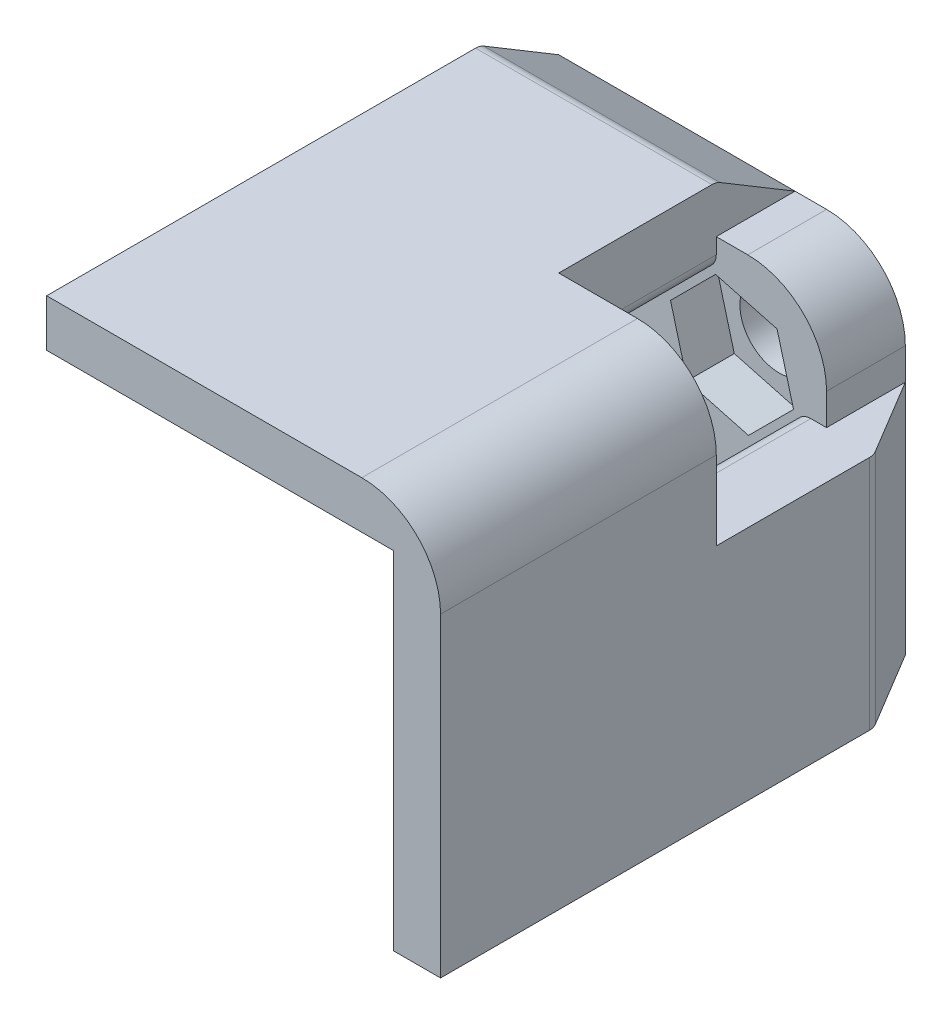
ISO-10303-21;
HEADER;
FILE_DESCRIPTION(('STEP AP214'),'2;1');
FILE_NAME('part.step','',(''),(''),'','','');
FILE_SCHEMA(('AUTOMOTIVE_DESIGN { 1 0 10303 214 1 1 1 1 }'));
ENDSEC;
DATA;
#1=APPLICATION_CONTEXT('core data for automotive mechanical design processes');
#2=APPLICATION_PROTOCOL_DEFINITION('international standard','automotive_design',2000,#1);
#3=PRODUCT_CONTEXT('',#1,'mechanical');
#4=PRODUCT('Part','Part','',(#3));
#5=PRODUCT_RELATED_PRODUCT_CATEGORY('part','',(#4));
#6=PRODUCT_DEFINITION_FORMATION('','',#4);
#7=PRODUCT_DEFINITION_CONTEXT('part definition',#1,'design');
#8=PRODUCT_DEFINITION('design','',#6,#7);
#9=PRODUCT_DEFINITION_SHAPE('','',#8);
#10=(LENGTH_UNIT() NAMED_UNIT(*) SI_UNIT(.MILLI.,.METRE.));
#11=(NAMED_UNIT(*) PLANE_ANGLE_UNIT() SI_UNIT($,.RADIAN.));
#12=(NAMED_UNIT(*) SI_UNIT($,.STERADIAN.) SOLID_ANGLE_UNIT());
#13=UNCERTAINTY_MEASURE_WITH_UNIT(LENGTH_MEASURE(1.E-05),#10,'distance_accuracy_value','');
#14=(GEOMETRIC_REPRESENTATION_CONTEXT(3) GLOBAL_UNCERTAINTY_ASSIGNED_CONTEXT((#13)) GLOBAL_UNIT_ASSIGNED_CONTEXT((#10,
#11,#12)) REPRESENTATION_CONTEXT('',''));
#15=CARTESIAN_POINT('',(0.,0.,0.));
#16=DIRECTION('',(0.,0.,1.));
#17=DIRECTION('',(1.,0.,0.));
#18=AXIS2_PLACEMENT_3D('',#15,#16,#17);
#19=CARTESIAN_POINT('',(13.9876299211209,8.84426229508197,-5.));
#20=DIRECTION('',(0.,-1.,0.));
#21=DIRECTION('',(1.,0.,0.));
#22=AXIS2_PLACEMENT_3D('',#19,#20,#21);
#23=PLANE('',#22);
#24=DIRECTION('',(-1.,0.,0.));
#25=VECTOR('',#24,1.);
#26=CARTESIAN_POINT('',(13.9876299211209,8.84426229508197,0.));
#27=LINE('',#26,#25);
#28=CARTESIAN_POINT('',(5.98762992112091,8.84426229508197,0.));
#29=VERTEX_POINT('',#28);
#30=CARTESIAN_POINT('',(3.9876299211209,8.84426229508197,0.));
#31=VERTEX_POINT('',#30);
#32=EDGE_CURVE('E321',#29,#31,#27,.T.);
#33=ORIENTED_EDGE('',*,*,#32,.F.);
#34=DIRECTION('',(0.,0.,-1.));
#35=VECTOR('',#34,1.);
#36=CARTESIAN_POINT('',(5.98762992112091,8.84426229508197,-5.));
#37=LINE('',#36,#35);
#38=CARTESIAN_POINT('',(5.98762992112091,8.84426229508197,-5.));
#39=VERTEX_POINT('',#38);
#40=EDGE_CURVE('E432',#29,#39,#37,.T.);
#41=ORIENTED_EDGE('',*,*,#40,.T.);
#42=DIRECTION('',(-1.,0.,0.));
#43=VECTOR('',#42,1.);
#44=CARTESIAN_POINT('',(13.9876299211209,8.84426229508197,-5.));
#45=LINE('',#44,#43);
#46=CARTESIAN_POINT('',(3.9876299211209,8.84426229508197,-5.));
#47=VERTEX_POINT('',#46);
#48=EDGE_CURVE('E318',#39,#47,#45,.T.);
#49=ORIENTED_EDGE('',*,*,#48,.T.);
#50=DIRECTION('',(0.,0.,1.));
#51=VECTOR('',#50,1.);
#52=CARTESIAN_POINT('',(3.9876299211209,8.84426229508197,0.));
#53=LINE('',#52,#51);
#54=EDGE_CURVE('E295',#47,#31,#53,.T.);
#55=ORIENTED_EDGE('',*,*,#54,.T.);
#56=EDGE_LOOP('',(#33,#41,#49,#55));
#57=FACE_BOUND('',#56,.T.);
#58=ADVANCED_FACE('F33',(#57),#23,.F.);
#59=CARTESIAN_POINT('',(0.,0.,25.));
#60=DIRECTION('',(0.,0.,-1.));
#61=DIRECTION('',(-1.,0.,0.));
#62=AXIS2_PLACEMENT_3D('',#59,#60,#61);
#63=PLANE('',#62);
#64=DIRECTION('',(0.,-1.,0.));
#65=VECTOR('',#64,1.);
#66=CARTESIAN_POINT('',(10.9876299211209,8.84426229508198,25.));
#67=LINE('',#66,#65);
#68=CARTESIAN_POINT('',(10.9876299211209,8.84426229508198,25.));
#69=VERTEX_POINT('',#68);
#70=CARTESIAN_POINT('',(10.9876299211209,-13.155737704918,25.));
#71=VERTEX_POINT('',#70);
#72=EDGE_CURVE('E366',#69,#71,#67,.T.);
#73=ORIENTED_EDGE('',*,*,#72,.F.);
#74=DIRECTION('',(1.,0.,0.));
#75=VECTOR('',#74,1.);
#76=CARTESIAN_POINT('',(-11.0123700788791,8.84426229508198,25.));
#77=LINE('',#76,#75);
#78=CARTESIAN_POINT('',(-11.0123700788791,8.84426229508198,25.));
#79=VERTEX_POINT('',#78);
#80=EDGE_CURVE('E371',#79,#69,#77,.T.);
#81=ORIENTED_EDGE('',*,*,#80,.F.);
#82=DIRECTION('',(0.,-1.,0.));
#83=VECTOR('',#82,1.);
#84=CARTESIAN_POINT('',(-11.0123700788791,6.84426229508197,25.));
#85=LINE('',#84,#83);
#86=CARTESIAN_POINT('',(-11.0123700788791,6.84426229508197,25.));
#87=VERTEX_POINT('',#86);
#88=EDGE_CURVE('E397',#79,#87,#85,.T.);
#89=ORIENTED_EDGE('',*,*,#88,.T.);
#90=DIRECTION('',(1.,0.,0.));
#91=VECTOR('',#90,1.);
#92=CARTESIAN_POINT('',(8.9876299211209,6.84426229508197,25.));
#93=LINE('',#92,#91);
#94=CARTESIAN_POINT('',(8.9876299211209,6.84426229508197,25.));
#95=VERTEX_POINT('',#94);
#96=EDGE_CURVE('E399',#87,#95,#93,.T.);
#97=ORIENTED_EDGE('',*,*,#96,.T.);
#98=DIRECTION('',(0.,-1.,0.));
#99=VECTOR('',#98,1.);
#100=CARTESIAN_POINT('',(8.9876299211209,-13.155737704918,25.));
#101=LINE('',#100,#99);
#102=CARTESIAN_POINT('',(8.9876299211209,-13.155737704918,25.));
#103=VERTEX_POINT('',#102);
#104=EDGE_CURVE('E402',#95,#103,#101,.T.);
#105=ORIENTED_EDGE('',*,*,#104,.T.);
#106=DIRECTION('',(1.,0.,0.));
#107=VECTOR('',#106,1.);
#108=CARTESIAN_POINT('',(13.9876299211209,-13.155737704918,25.));
#109=LINE('',#108,#107);
#110=EDGE_CURVE('E404',#103,#71,#109,.T.);
#111=ORIENTED_EDGE('',*,*,#110,.T.);
#112=EDGE_LOOP('',(#73,#81,#89,#97,#105,#111));
#113=FACE_BOUND('',#112,.T.);
#114=ADVANCED_FACE('F500',(#113),#63,.F.);
#115=CARTESIAN_POINT('',(-11.0123700788791,6.84426229508197,25.));
#116=DIRECTION('',(1.,0.,0.));
#117=DIRECTION('',(0.,1.,0.));
#118=AXIS2_PLACEMENT_3D('',#115,#116,#117);
#119=PLANE('',#118);
#120=DIRECTION('',(0.,0.,-1.));
#121=VECTOR('',#120,1.);
#122=CARTESIAN_POINT('',(-11.0123700788791,11.844262295082,25.));
#123=LINE('',#122,#121);
#124=CARTESIAN_POINT('',(-11.0123700788791,11.844262295082,27.5));
#125=VERTEX_POINT('',#124);
#126=CARTESIAN_POINT('',(-11.0123700788791,11.844262295082,0.276983964948432));
#127=VERTEX_POINT('',#126);
#128=EDGE_CURVE('E406',#125,#127,#123,.T.);
#129=ORIENTED_EDGE('',*,*,#128,.T.);
#130=CARTESIAN_POINT('',(-11.0123700788791,10.844262295082,0.276983964948432));
#131=DIRECTION('',(1.,0.,0.));
#132=DIRECTION('',(0.,1.,0.));
#133=AXIS2_PLACEMENT_3D('',#130,#131,#132);
#134=CIRCLE('',#133,1.);
#135=CARTESIAN_POINT('',(-11.0123700788791,11.7017552207945,-0.237511790479096));
#136=VERTEX_POINT('',#135);
#137=EDGE_CURVE('E464',#127,#136,#134,.F.);
#138=ORIENTED_EDGE('',*,*,#137,.T.);
#139=DIRECTION('',(0.,-0.514495755427526,-0.857492925712544));
#140=VECTOR('',#139,1.);
#141=CARTESIAN_POINT('',(-11.0123700788791,8.84426229508198,-5.));
#142=LINE('',#141,#140);
#143=CARTESIAN_POINT('',(-11.0123700788791,8.84426229508198,-5.));
#144=VERTEX_POINT('',#143);
#145=EDGE_CURVE('E294',#136,#144,#142,.T.);
#146=ORIENTED_EDGE('',*,*,#145,.T.);
#147=DIRECTION('',(0.,1.,0.));
#148=VECTOR('',#147,1.);
#149=CARTESIAN_POINT('',(-11.0123700788791,11.844262295082,-5.));
#150=LINE('',#149,#148);
#151=CARTESIAN_POINT('',(-11.0123700788791,6.84426229508197,-5.));
#152=VERTEX_POINT('',#151);
#153=EDGE_CURVE('E351',#152,#144,#150,.T.);
#154=ORIENTED_EDGE('',*,*,#153,.F.);
#155=DIRECTION('',(0.,0.,1.));
#156=VECTOR('',#155,1.);
#157=CARTESIAN_POINT('',(-11.0123700788791,6.84426229508197,-5.));
#158=LINE('',#157,#156);
#159=CARTESIAN_POINT('',(-11.0123700788791,6.84426229508197,0.));
#160=VERTEX_POINT('',#159);
#161=EDGE_CURVE('E358',#152,#160,#158,.T.);
#162=ORIENTED_EDGE('',*,*,#161,.T.);
#163=DIRECTION('',(0.,0.,-1.));
#164=VECTOR('',#163,1.);
#165=CARTESIAN_POINT('',(-11.0123700788791,6.84426229508197,25.));
#166=LINE('',#165,#164);
#167=EDGE_CURVE('E420',#87,#160,#166,.T.);
#168=ORIENTED_EDGE('',*,*,#167,.F.);
#169=ORIENTED_EDGE('',*,*,#88,.F.);
#170=DIRECTION('',(0.,0.,-1.));
#171=VECTOR('',#170,1.);
#172=CARTESIAN_POINT('',(-11.0123700788791,8.84426229508198,27.5));
#173=LINE('',#172,#171);
#174=CARTESIAN_POINT('',(-11.0123700788791,8.84426229508198,27.5));
#175=VERTEX_POINT('',#174);
#176=EDGE_CURVE('E390',#175,#79,#173,.T.);
#177=ORIENTED_EDGE('',*,*,#176,.F.);
#178=DIRECTION('',(0.,-1.,0.));
#179=VECTOR('',#178,1.);
#180=CARTESIAN_POINT('',(-11.0123700788791,11.844262295082,27.5));
#181=LINE('',#180,#179);
#182=EDGE_CURVE('E379',#125,#175,#181,.T.);
#183=ORIENTED_EDGE('',*,*,#182,.F.);
#184=EDGE_LOOP('',(#129,#138,#146,#154,#162,#168,#169,#177,#183));
#185=FACE_BOUND('',#184,.T.);
#186=ADVANCED_FACE('F506',(#185),#119,.F.);
#187=CARTESIAN_POINT('',(8.9876299211209,6.84426229508197,25.));
#188=DIRECTION('',(0.,1.,0.));
#189=DIRECTION('',(-1.,0.,0.));
#190=AXIS2_PLACEMENT_3D('',#187,#188,#189);
#191=PLANE('',#190);
#192=DIRECTION('',(1.,0.,0.));
#193=VECTOR('',#192,1.);
#194=CARTESIAN_POINT('',(8.9876299211209,6.84426229508197,0.));
#195=LINE('',#194,#193);
#196=CARTESIAN_POINT('',(2.9876299211209,6.84426229508197,0.));
#197=VERTEX_POINT('',#196);
#198=EDGE_CURVE('E396',#160,#197,#195,.T.);
#199=ORIENTED_EDGE('',*,*,#198,.T.);
#200=DIRECTION('',(0.,0.,-1.));
#201=VECTOR('',#200,1.);
#202=CARTESIAN_POINT('',(2.9876299211209,6.84426229508197,10.));
#203=LINE('',#202,#201);
#204=CARTESIAN_POINT('',(2.9876299211209,6.84426229508197,10.));
#205=VERTEX_POINT('',#204);
#206=EDGE_CURVE('E449',#197,#205,#203,.F.);
#207=ORIENTED_EDGE('',*,*,#206,.T.);
#208=DIRECTION('',(1.,0.,0.));
#209=VECTOR('',#208,1.);
#210=CARTESIAN_POINT('',(8.9876299211209,6.84426229508197,10.));
#211=LINE('',#210,#209);
#212=CARTESIAN_POINT('',(8.9876299211209,6.84426229508197,10.));
#213=VERTEX_POINT('',#212);
#214=EDGE_CURVE('E347',#205,#213,#211,.T.);
#215=ORIENTED_EDGE('',*,*,#214,.T.);
#216=DIRECTION('',(0.,0.,-1.));
#217=VECTOR('',#216,1.);
#218=CARTESIAN_POINT('',(8.9876299211209,6.84426229508197,25.));
#219=LINE('',#218,#217);
#220=EDGE_CURVE('E417',#95,#213,#219,.T.);
#221=ORIENTED_EDGE('',*,*,#220,.F.);
#222=ORIENTED_EDGE('',*,*,#96,.F.);
#223=ORIENTED_EDGE('',*,*,#167,.T.);
#224=EDGE_LOOP('',(#199,#207,#215,#221,#222,#223));
#225=FACE_BOUND('',#224,.T.);
#226=ADVANCED_FACE('F559',(#225),#191,.F.);
#227=CARTESIAN_POINT('',(8.9876299211209,-13.155737704918,25.));
#228=DIRECTION('',(1.,0.,0.));
#229=DIRECTION('',(0.,1.,0.));
#230=AXIS2_PLACEMENT_3D('',#227,#228,#229);
#231=PLANE('',#230);
#232=DIRECTION('',(0.,-1.,0.));
#233=VECTOR('',#232,1.);
#234=CARTESIAN_POINT('',(8.9876299211209,-13.155737704918,10.));
#235=LINE('',#234,#233);
#236=CARTESIAN_POINT('',(8.9876299211209,0.844262295081969,10.));
#237=VERTEX_POINT('',#236);
#238=EDGE_CURVE('E342',#213,#237,#235,.T.);
#239=ORIENTED_EDGE('',*,*,#238,.T.);
#240=DIRECTION('',(0.,0.,-1.));
#241=VECTOR('',#240,1.);
#242=CARTESIAN_POINT('',(8.9876299211209,0.844262295081969,25.));
#243=LINE('',#242,#241);
#244=CARTESIAN_POINT('',(8.9876299211209,0.844262295081969,0.));
#245=VERTEX_POINT('',#244);
#246=EDGE_CURVE('E441',#237,#245,#243,.T.);
#247=ORIENTED_EDGE('',*,*,#246,.T.);
#248=DIRECTION('',(0.,-1.,0.));
#249=VECTOR('',#248,1.);
#250=CARTESIAN_POINT('',(8.9876299211209,-13.155737704918,0.));
#251=LINE('',#250,#249);
#252=CARTESIAN_POINT('',(8.9876299211209,-13.155737704918,0.));
#253=VERTEX_POINT('',#252);
#254=EDGE_CURVE('E400',#245,#253,#251,.T.);
#255=ORIENTED_EDGE('',*,*,#254,.T.);
#256=DIRECTION('',(0.,0.,-1.));
#257=VECTOR('',#256,1.);
#258=CARTESIAN_POINT('',(8.9876299211209,-13.155737704918,25.));
#259=LINE('',#258,#257);
#260=EDGE_CURVE('E414',#103,#253,#259,.T.);
#261=ORIENTED_EDGE('',*,*,#260,.F.);
#262=ORIENTED_EDGE('',*,*,#104,.F.);
#263=ORIENTED_EDGE('',*,*,#220,.T.);
#264=EDGE_LOOP('',(#239,#247,#255,#261,#262,#263));
#265=FACE_BOUND('',#264,.T.);
#266=ADVANCED_FACE('F556',(#265),#231,.F.);
#267=CARTESIAN_POINT('',(13.9876299211209,-13.155737704918,25.));
#268=DIRECTION('',(0.,1.,0.));
#269=DIRECTION('',(-1.,0.,0.));
#270=AXIS2_PLACEMENT_3D('',#267,#268,#269);
#271=PLANE('',#270);
#272=DIRECTION('',(0.514495755427526,0.,0.857492925712545));
#273=VECTOR('',#272,1.);
#274=CARTESIAN_POINT('',(13.9876299211209,-13.155737704918,0.));
#275=LINE('',#274,#273);
#276=CARTESIAN_POINT('',(10.9876299211209,-13.155737704918,-5.));
#277=VERTEX_POINT('',#276);
#278=CARTESIAN_POINT('',(13.8451228468334,-13.155737704918,-0.237511790479092));
#279=VERTEX_POINT('',#278);
#280=EDGE_CURVE('E304',#277,#279,#275,.T.);
#281=ORIENTED_EDGE('',*,*,#280,.T.);
#282=CARTESIAN_POINT('',(12.9876299211209,-13.155737704918,0.276983964948434));
#283=DIRECTION('',(0.,1.,0.));
#284=DIRECTION('',(-1.,0.,0.));
#285=AXIS2_PLACEMENT_3D('',#282,#283,#284);
#286=CIRCLE('',#285,1.);
#287=CARTESIAN_POINT('',(13.9876299211209,-13.155737704918,0.276983964948435));
#288=VERTEX_POINT('',#287);
#289=EDGE_CURVE('E55',#279,#288,#286,.F.);
#290=ORIENTED_EDGE('',*,*,#289,.T.);
#291=DIRECTION('',(0.,0.,-1.));
#292=VECTOR('',#291,1.);
#293=CARTESIAN_POINT('',(13.9876299211209,-13.155737704918,25.));
#294=LINE('',#293,#292);
#295=CARTESIAN_POINT('',(13.9876299211209,-13.155737704918,27.5));
#296=VERTEX_POINT('',#295);
#297=EDGE_CURVE('E412',#296,#288,#294,.T.);
#298=ORIENTED_EDGE('',*,*,#297,.F.);
#299=DIRECTION('',(1.,0.,0.));
#300=VECTOR('',#299,1.);
#301=CARTESIAN_POINT('',(10.9876299211209,-13.155737704918,27.5));
#302=LINE('',#301,#300);
#303=CARTESIAN_POINT('',(10.9876299211209,-13.155737704918,27.5));
#304=VERTEX_POINT('',#303);
#305=EDGE_CURVE('E370',#304,#296,#302,.T.);
#306=ORIENTED_EDGE('',*,*,#305,.F.);
#307=DIRECTION('',(0.,0.,-1.));
#308=VECTOR('',#307,1.);
#309=CARTESIAN_POINT('',(10.9876299211209,-13.155737704918,27.5));
#310=LINE('',#309,#308);
#311=EDGE_CURVE('E393',#304,#71,#310,.T.);
#312=ORIENTED_EDGE('',*,*,#311,.T.);
#313=ORIENTED_EDGE('',*,*,#110,.F.);
#314=ORIENTED_EDGE('',*,*,#260,.T.);
#315=DIRECTION('',(0.,0.,1.));
#316=VECTOR('',#315,1.);
#317=CARTESIAN_POINT('',(8.9876299211209,-13.155737704918,-5.));
#318=LINE('',#317,#316);
#319=CARTESIAN_POINT('',(8.9876299211209,-13.155737704918,-5.));
#320=VERTEX_POINT('',#319);
#321=EDGE_CURVE('E363',#320,#253,#318,.T.);
#322=ORIENTED_EDGE('',*,*,#321,.F.);
#323=DIRECTION('',(-1.,0.,0.));
#324=VECTOR('',#323,1.);
#325=CARTESIAN_POINT('',(8.9876299211209,-13.155737704918,-5.));
#326=LINE('',#325,#324);
#327=EDGE_CURVE('E354',#277,#320,#326,.T.);
#328=ORIENTED_EDGE('',*,*,#327,.F.);
#329=EDGE_LOOP('',(#281,#290,#298,#306,#312,#313,#314,#322,#328));
#330=FACE_BOUND('',#329,.T.);
#331=ADVANCED_FACE('F481',(#330),#271,.F.);
#332=CARTESIAN_POINT('',(13.9876299211209,11.844262295082,25.));
#333=DIRECTION('',(-1.,0.,0.));
#334=DIRECTION('',(0.,-1.,0.));
#335=AXIS2_PLACEMENT_3D('',#332,#333,#334);
#336=PLANE('',#335);
#337=ORIENTED_EDGE('',*,*,#297,.T.);
#338=DIRECTION('',(0.,-1.,0.));
#339=VECTOR('',#338,1.);
#340=CARTESIAN_POINT('',(13.9876299211209,1.84426229508197,0.276983964948424));
#341=LINE('',#340,#339);
#342=CARTESIAN_POINT('',(13.9876299211209,1.84426229508197,0.276983964948423));
#343=VERTEX_POINT('',#342);
#344=EDGE_CURVE('E41',#288,#343,#341,.F.);
#345=ORIENTED_EDGE('',*,*,#344,.T.);
#346=DIRECTION('',(0.,0.,-1.));
#347=VECTOR('',#346,1.);
#348=CARTESIAN_POINT('',(13.9876299211209,1.84426229508197,10.));
#349=LINE('',#348,#347);
#350=CARTESIAN_POINT('',(13.9876299211209,1.84426229508197,10.));
#351=VERTEX_POINT('',#350);
#352=EDGE_CURVE('E331',#351,#343,#349,.T.);
#353=ORIENTED_EDGE('',*,*,#352,.F.);
#354=DIRECTION('',(0.,-1.,0.));
#355=VECTOR('',#354,1.);
#356=CARTESIAN_POINT('',(13.9876299211209,11.844262295082,10.));
#357=LINE('',#356,#355);
#358=CARTESIAN_POINT('',(13.9876299211209,6.84426229508197,10.));
#359=VERTEX_POINT('',#358);
#360=EDGE_CURVE('E324',#359,#351,#357,.T.);
#361=ORIENTED_EDGE('',*,*,#360,.F.);
#362=DIRECTION('',(0.,0.,-1.));
#363=VECTOR('',#362,1.);
#364=CARTESIAN_POINT('',(13.9876299211209,6.84426229508197,25.));
#365=LINE('',#364,#363);
#366=CARTESIAN_POINT('',(13.9876299211209,6.84426229508197,27.5));
#367=VERTEX_POINT('',#366);
#368=EDGE_CURVE('E428',#359,#367,#365,.F.);
#369=ORIENTED_EDGE('',*,*,#368,.T.);
#370=DIRECTION('',(0.,1.,0.));
#371=VECTOR('',#370,1.);
#372=CARTESIAN_POINT('',(13.9876299211209,-13.155737704918,27.5));
#373=LINE('',#372,#371);
#374=EDGE_CURVE('E374',#296,#367,#373,.T.);
#375=ORIENTED_EDGE('',*,*,#374,.F.);
#376=EDGE_LOOP('',(#337,#345,#353,#361,#369,#375));
#377=FACE_BOUND('',#376,.T.);
#378=ADVANCED_FACE('F550',(#377),#336,.F.);
#379=CARTESIAN_POINT('',(-11.0123700788791,11.844262295082,25.));
#380=DIRECTION('',(0.,-1.,0.));
#381=DIRECTION('',(0.,0.,-1.));
#382=AXIS2_PLACEMENT_3D('',#379,#380,#381);
#383=PLANE('',#382);
#384=DIRECTION('',(0.,0.,1.));
#385=VECTOR('',#384,1.);
#386=CARTESIAN_POINT('',(3.9876299211209,11.844262295082,10.));
#387=LINE('',#386,#385);
#388=CARTESIAN_POINT('',(3.9876299211209,11.844262295082,0.27698396494844));
#389=VERTEX_POINT('',#388);
#390=CARTESIAN_POINT('',(3.9876299211209,11.844262295082,10.));
#391=VERTEX_POINT('',#390);
#392=EDGE_CURVE('E333',#389,#391,#387,.T.);
#393=ORIENTED_EDGE('',*,*,#392,.F.);
#394=DIRECTION('',(-1.,0.,0.));
#395=VECTOR('',#394,1.);
#396=CARTESIAN_POINT('',(-11.0123700788791,11.844262295082,0.276983964948432));
#397=LINE('',#396,#395);
#398=EDGE_CURVE('E461',#389,#127,#397,.T.);
#399=ORIENTED_EDGE('',*,*,#398,.T.);
#400=ORIENTED_EDGE('',*,*,#128,.F.);
#401=DIRECTION('',(-1.,0.,0.));
#402=VECTOR('',#401,1.);
#403=CARTESIAN_POINT('',(13.9876299211209,11.844262295082,27.5));
#404=LINE('',#403,#402);
#405=CARTESIAN_POINT('',(8.9876299211209,11.844262295082,27.5));
#406=VERTEX_POINT('',#405);
#407=EDGE_CURVE('E377',#406,#125,#404,.T.);
#408=ORIENTED_EDGE('',*,*,#407,.F.);
#409=DIRECTION('',(0.,0.,-1.));
#410=VECTOR('',#409,1.);
#411=CARTESIAN_POINT('',(8.9876299211209,11.844262295082,25.));
#412=LINE('',#411,#410);
#413=CARTESIAN_POINT('',(8.9876299211209,11.844262295082,10.));
#414=VERTEX_POINT('',#413);
#415=EDGE_CURVE('E423',#406,#414,#412,.T.);
#416=ORIENTED_EDGE('',*,*,#415,.T.);
#417=DIRECTION('',(1.,0.,0.));
#418=VECTOR('',#417,1.);
#419=CARTESIAN_POINT('',(3.9876299211209,11.844262295082,10.));
#420=LINE('',#419,#418);
#421=EDGE_CURVE('E339',#391,#414,#420,.T.);
#422=ORIENTED_EDGE('',*,*,#421,.F.);
#423=EDGE_LOOP('',(#393,#399,#400,#408,#416,#422));
#424=FACE_BOUND('',#423,.T.);
#425=ADVANCED_FACE('F545',(#424),#383,.F.);
#426=CARTESIAN_POINT('',(10.9876299211209,8.84426229508198,27.5));
#427=DIRECTION('',(1.,0.,0.));
#428=DIRECTION('',(0.,1.,0.));
#429=AXIS2_PLACEMENT_3D('',#426,#427,#428);
#430=PLANE('',#429);
#431=ORIENTED_EDGE('',*,*,#72,.T.);
#432=ORIENTED_EDGE('',*,*,#311,.F.);
#433=DIRECTION('',(0.,-1.,0.));
#434=VECTOR('',#433,1.);
#435=CARTESIAN_POINT('',(10.9876299211209,8.84426229508198,27.5));
#436=LINE('',#435,#434);
#437=CARTESIAN_POINT('',(10.9876299211209,8.84426229508198,27.5));
#438=VERTEX_POINT('',#437);
#439=EDGE_CURVE('E367',#438,#304,#436,.T.);
#440=ORIENTED_EDGE('',*,*,#439,.F.);
#441=DIRECTION('',(0.,0.,-1.));
#442=VECTOR('',#441,1.);
#443=CARTESIAN_POINT('',(10.9876299211209,8.84426229508198,27.5));
#444=LINE('',#443,#442);
#445=EDGE_CURVE('E383',#438,#69,#444,.T.);
#446=ORIENTED_EDGE('',*,*,#445,.T.);
#447=EDGE_LOOP('',(#431,#432,#440,#446));
#448=FACE_BOUND('',#447,.T.);
#449=ADVANCED_FACE('F542',(#448),#430,.F.);
#450=CARTESIAN_POINT('',(-11.0123700788791,8.84426229508198,27.5));
#451=DIRECTION('',(0.,1.,0.));
#452=DIRECTION('',(0.,0.,1.));
#453=AXIS2_PLACEMENT_3D('',#450,#451,#452);
#454=PLANE('',#453);
#455=ORIENTED_EDGE('',*,*,#80,.T.);
#456=ORIENTED_EDGE('',*,*,#445,.F.);
#457=DIRECTION('',(1.,0.,0.));
#458=VECTOR('',#457,1.);
#459=CARTESIAN_POINT('',(-11.0123700788791,8.84426229508198,27.5));
#460=LINE('',#459,#458);
#461=EDGE_CURVE('E381',#175,#438,#460,.T.);
#462=ORIENTED_EDGE('',*,*,#461,.F.);
#463=ORIENTED_EDGE('',*,*,#176,.T.);
#464=EDGE_LOOP('',(#455,#456,#462,#463));
#465=FACE_BOUND('',#464,.T.);
#466=ADVANCED_FACE('F538',(#465),#454,.F.);
#467=CARTESIAN_POINT('',(0.,0.,27.5));
#468=DIRECTION('',(0.,0.,1.));
#469=DIRECTION('',(1.,0.,0.));
#470=AXIS2_PLACEMENT_3D('',#467,#468,#469);
#471=PLANE('',#470);
#472=ORIENTED_EDGE('',*,*,#374,.T.);
#473=CARTESIAN_POINT('',(8.9876299211209,6.84426229508197,27.5));
#474=DIRECTION('',(0.,0.,1.));
#475=DIRECTION('',(1.,0.,0.));
#476=AXIS2_PLACEMENT_3D('',#473,#474,#475);
#477=CIRCLE('',#476,5.);
#478=EDGE_CURVE('E430',#367,#406,#477,.T.);
#479=ORIENTED_EDGE('',*,*,#478,.T.);
#480=ORIENTED_EDGE('',*,*,#407,.T.);
#481=ORIENTED_EDGE('',*,*,#182,.T.);
#482=ORIENTED_EDGE('',*,*,#461,.T.);
#483=ORIENTED_EDGE('',*,*,#439,.T.);
#484=ORIENTED_EDGE('',*,*,#305,.T.);
#485=EDGE_LOOP('',(#472,#479,#480,#481,#482,#483,#484));
#486=FACE_BOUND('',#485,.T.);
#487=ADVANCED_FACE('F531',(#486),#471,.T.);
#488=CARTESIAN_POINT('',(0.,0.,0.));
#489=DIRECTION('',(0.,0.,1.));
#490=DIRECTION('',(1.,0.,0.));
#491=AXIS2_PLACEMENT_3D('',#488,#489,#490);
#492=PLANE('',#491);
#493=DIRECTION('',(0.258819045102522,-0.965925826289068,0.));
#494=VECTOR('',#493,1.);
#495=CARTESIAN_POINT('',(1.08388717034447,3.89026701261136,0.));
#496=LINE('',#495,#494);
#497=CARTESIAN_POINT('',(1.08388717034447,3.89026701261136,0.));
#498=VERTEX_POINT('',#497);
#499=CARTESIAN_POINT('',(2.12989188787387,-0.0134757381650737,0.));
#500=VERTEX_POINT('',#499);
#501=EDGE_CURVE('E236',#498,#500,#496,.T.);
#502=ORIENTED_EDGE('',*,*,#501,.F.);
#503=DIRECTION('',(-0.707106781186548,-0.707106781186548,0.));
#504=VECTOR('',#503,1.);
#505=CARTESIAN_POINT('',(3.94162520359151,6.74800504585841,0.));
#506=LINE('',#505,#504);
#507=CARTESIAN_POINT('',(3.94162520359151,6.74800504585841,0.));
#508=VERTEX_POINT('',#507);
#509=EDGE_CURVE('E255',#508,#498,#506,.T.);
#510=ORIENTED_EDGE('',*,*,#509,.F.);
#511=DIRECTION('',(-0.965925826289068,0.258819045102521,0.));
#512=VECTOR('',#511,1.);
#513=CARTESIAN_POINT('',(7.84536795436795,5.70200032832901,0.));
#514=LINE('',#513,#512);
#515=CARTESIAN_POINT('',(7.84536795436795,5.70200032832901,0.));
#516=VERTEX_POINT('',#515);
#517=EDGE_CURVE('E258',#516,#508,#514,.T.);
#518=ORIENTED_EDGE('',*,*,#517,.F.);
#519=DIRECTION('',(-0.258819045102522,0.965925826289068,0.));
#520=VECTOR('',#519,1.);
#521=CARTESIAN_POINT('',(8.89137267189735,1.79825757755258,0.));
#522=LINE('',#521,#520);
#523=CARTESIAN_POINT('',(8.89137267189735,1.79825757755258,0.));
#524=VERTEX_POINT('',#523);
#525=EDGE_CURVE('E274',#524,#516,#522,.T.);
#526=ORIENTED_EDGE('',*,*,#525,.F.);
#527=DIRECTION('',(0.707106781186548,0.707106781186548,0.));
#528=VECTOR('',#527,1.);
#529=CARTESIAN_POINT('',(6.03363463865031,-1.05948045569447,0.));
#530=LINE('',#529,#528);
#531=CARTESIAN_POINT('',(6.03363463865031,-1.05948045569447,0.));
#532=VERTEX_POINT('',#531);
#533=EDGE_CURVE('E271',#532,#524,#530,.T.);
#534=ORIENTED_EDGE('',*,*,#533,.F.);
#535=DIRECTION('',(0.965925826289068,-0.258819045102521,0.));
#536=VECTOR('',#535,1.);
#537=CARTESIAN_POINT('',(2.12989188787387,-0.0134757381650735,0.));
#538=LINE('',#537,#536);
#539=EDGE_CURVE('E269',#500,#532,#538,.T.);
#540=ORIENTED_EDGE('',*,*,#539,.F.);
#541=EDGE_LOOP('',(#502,#510,#518,#526,#534,#540));
#542=FACE_BOUND('',#541,.T.);
#543=DIRECTION('',(0.,-1.,0.));
#544=VECTOR('',#543,1.);
#545=CARTESIAN_POINT('',(10.9876299211209,8.84426229508197,0.));
#546=LINE('',#545,#544);
#547=CARTESIAN_POINT('',(10.9876299211209,3.84426229508197,0.));
#548=VERTEX_POINT('',#547);
#549=CARTESIAN_POINT('',(10.9876299211209,1.84426229508197,0.));
#550=VERTEX_POINT('',#549);
#551=EDGE_CURVE('E315',#548,#550,#546,.T.);
#552=ORIENTED_EDGE('',*,*,#551,.F.);
#553=CARTESIAN_POINT('',(5.98762992112091,3.84426229508197,0.));
#554=DIRECTION('',(0.,0.,1.));
#555=DIRECTION('',(1.,0.,0.));
#556=AXIS2_PLACEMENT_3D('',#553,#554,#555);
#557=CIRCLE('',#556,5.);
#558=EDGE_CURVE('E439',#548,#29,#557,.T.);
#559=ORIENTED_EDGE('',*,*,#558,.T.);
#560=ORIENTED_EDGE('',*,*,#32,.T.);
#561=DIRECTION('',(0.,1.,0.));
#562=VECTOR('',#561,1.);
#563=CARTESIAN_POINT('',(3.9876299211209,11.844262295082,0.));
#564=LINE('',#563,#562);
#565=CARTESIAN_POINT('',(3.9876299211209,7.84426229508197,0.));
#566=VERTEX_POINT('',#565);
#567=EDGE_CURVE('E330',#566,#31,#564,.T.);
#568=ORIENTED_EDGE('',*,*,#567,.F.);
#569=CARTESIAN_POINT('',(2.9876299211209,7.84426229508197,0.));
#570=DIRECTION('',(0.,0.,1.));
#571=DIRECTION('',(1.,0.,0.));
#572=AXIS2_PLACEMENT_3D('',#569,#570,#571);
#573=CIRCLE('',#572,1.);
#574=EDGE_CURVE('E457',#566,#197,#573,.F.);
#575=ORIENTED_EDGE('',*,*,#574,.T.);
#576=ORIENTED_EDGE('',*,*,#198,.F.);
#577=DIRECTION('',(-0.707106781186548,0.707106781186547,0.));
#578=VECTOR('',#577,1.);
#579=CARTESIAN_POINT('',(-11.0123700788791,6.84426229508197,0.));
#580=LINE('',#579,#578);
#581=EDGE_CURVE('E350',#253,#160,#580,.T.);
#582=ORIENTED_EDGE('',*,*,#581,.F.);
#583=ORIENTED_EDGE('',*,*,#254,.F.);
#584=CARTESIAN_POINT('',(9.9876299211209,0.844262295081969,0.));
#585=DIRECTION('',(0.,0.,1.));
#586=DIRECTION('',(1.,0.,0.));
#587=AXIS2_PLACEMENT_3D('',#584,#585,#586);
#588=CIRCLE('',#587,1.);
#589=CARTESIAN_POINT('',(9.9876299211209,1.84426229508197,0.));
#590=VERTEX_POINT('',#589);
#591=EDGE_CURVE('E452',#245,#590,#588,.F.);
#592=ORIENTED_EDGE('',*,*,#591,.T.);
#593=DIRECTION('',(1.,0.,0.));
#594=VECTOR('',#593,1.);
#595=CARTESIAN_POINT('',(3.9876299211209,1.84426229508197,0.));
#596=LINE('',#595,#594);
#597=EDGE_CURVE('E343',#590,#550,#596,.T.);
#598=ORIENTED_EDGE('',*,*,#597,.T.);
#599=EDGE_LOOP('',(#552,#559,#560,#568,#575,#576,#582,#583,#592,#598));
#600=FACE_BOUND('',#599,.T.);
#601=ADVANCED_FACE('F528',(#542,#600),#492,.T.);
#602=CARTESIAN_POINT('',(-11.0123700788791,6.84426229508197,-5.));
#603=DIRECTION('',(0.707106781186547,0.707106781186548,0.));
#604=DIRECTION('',(-0.707106781186548,0.707106781186547,0.));
#605=AXIS2_PLACEMENT_3D('',#602,#603,#604);
#606=PLANE('',#605);
#607=ORIENTED_EDGE('',*,*,#581,.T.);
#608=ORIENTED_EDGE('',*,*,#161,.F.);
#609=DIRECTION('',(-0.707106781186548,0.707106781186547,0.));
#610=VECTOR('',#609,1.);
#611=CARTESIAN_POINT('',(-11.0123700788791,6.84426229508197,-5.));
#612=LINE('',#611,#610);
#613=EDGE_CURVE('E356',#320,#152,#612,.T.);
#614=ORIENTED_EDGE('',*,*,#613,.F.);
#615=ORIENTED_EDGE('',*,*,#321,.T.);
#616=EDGE_LOOP('',(#607,#608,#614,#615));
#617=FACE_BOUND('',#616,.T.);
#618=ADVANCED_FACE('F526',(#617),#606,.F.);
#619=CARTESIAN_POINT('',(0.,0.,-5.));
#620=DIRECTION('',(0.,0.,1.));
#621=DIRECTION('',(1.,0.,0.));
#622=AXIS2_PLACEMENT_3D('',#619,#620,#621);
#623=PLANE('',#622);
#624=CARTESIAN_POINT('',(4.98762992112091,2.84426229508197,-5.));
#625=DIRECTION('',(0.,0.,1.));
#626=DIRECTION('',(1.,0.,0.));
#627=AXIS2_PLACEMENT_3D('',#624,#625,#626);
#628=CIRCLE('',#627,2.5);
#629=CARTESIAN_POINT('',(7.48762992112091,2.84426229508197,-5.));
#630=VERTEX_POINT('',#629);
#631=EDGE_CURVE('E291',#630,#630,#628,.T.);
#632=ORIENTED_EDGE('',*,*,#631,.T.);
#633=EDGE_LOOP('',(#632));
#634=FACE_BOUND('',#633,.T.);
#635=ORIENTED_EDGE('',*,*,#48,.F.);
#636=CARTESIAN_POINT('',(5.98762992112091,3.84426229508197,-5.));
#637=DIRECTION('',(0.,0.,1.));
#638=DIRECTION('',(1.,0.,0.));
#639=AXIS2_PLACEMENT_3D('',#636,#637,#638);
#640=CIRCLE('',#639,5.);
#641=CARTESIAN_POINT('',(10.9876299211209,3.84426229508197,-5.));
#642=VERTEX_POINT('',#641);
#643=EDGE_CURVE('E435',#39,#642,#640,.F.);
#644=ORIENTED_EDGE('',*,*,#643,.T.);
#645=DIRECTION('',(0.,-1.,0.));
#646=VECTOR('',#645,1.);
#647=CARTESIAN_POINT('',(10.9876299211209,8.84426229508197,-5.));
#648=LINE('',#647,#646);
#649=CARTESIAN_POINT('',(10.9876299211209,1.84426229508197,-5.));
#650=VERTEX_POINT('',#649);
#651=EDGE_CURVE('E316',#642,#650,#648,.T.);
#652=ORIENTED_EDGE('',*,*,#651,.T.);
#653=DIRECTION('',(0.,-1.,0.));
#654=VECTOR('',#653,1.);
#655=CARTESIAN_POINT('',(10.9876299211209,1.84426229508197,-5.));
#656=LINE('',#655,#654);
#657=EDGE_CURVE('E311',#650,#277,#656,.T.);
#658=ORIENTED_EDGE('',*,*,#657,.T.);
#659=ORIENTED_EDGE('',*,*,#327,.T.);
#660=ORIENTED_EDGE('',*,*,#613,.T.);
#661=ORIENTED_EDGE('',*,*,#153,.T.);
#662=DIRECTION('',(-1.,0.,0.));
#663=VECTOR('',#662,1.);
#664=CARTESIAN_POINT('',(3.9876299211209,8.84426229508197,-5.));
#665=LINE('',#664,#663);
#666=EDGE_CURVE('E300',#47,#144,#665,.T.);
#667=ORIENTED_EDGE('',*,*,#666,.F.);
#668=EDGE_LOOP('',(#635,#644,#652,#658,#659,#660,#661,#667));
#669=FACE_BOUND('',#668,.T.);
#670=ADVANCED_FACE('F486',(#634,#669),#623,.F.);
#671=CARTESIAN_POINT('',(3.9876299211209,11.844262295082,10.));
#672=DIRECTION('',(0.,0.,1.));
#673=DIRECTION('',(1.,0.,0.));
#674=AXIS2_PLACEMENT_3D('',#671,#672,#673);
#675=PLANE('',#674);
#676=ORIENTED_EDGE('',*,*,#421,.T.);
#677=CARTESIAN_POINT('',(8.9876299211209,6.84426229508197,10.));
#678=DIRECTION('',(0.,0.,1.));
#679=DIRECTION('',(1.,0.,0.));
#680=AXIS2_PLACEMENT_3D('',#677,#678,#679);
#681=CIRCLE('',#680,5.);
#682=EDGE_CURVE('E426',#414,#359,#681,.F.);
#683=ORIENTED_EDGE('',*,*,#682,.T.);
#684=ORIENTED_EDGE('',*,*,#360,.T.);
#685=DIRECTION('',(1.,0.,0.));
#686=VECTOR('',#685,1.);
#687=CARTESIAN_POINT('',(3.9876299211209,1.84426229508197,10.));
#688=LINE('',#687,#686);
#689=CARTESIAN_POINT('',(9.9876299211209,1.84426229508197,10.));
#690=VERTEX_POINT('',#689);
#691=EDGE_CURVE('E335',#690,#351,#688,.T.);
#692=ORIENTED_EDGE('',*,*,#691,.F.);
#693=CARTESIAN_POINT('',(9.9876299211209,0.844262295081969,10.));
#694=DIRECTION('',(0.,0.,1.));
#695=DIRECTION('',(1.,0.,0.));
#696=AXIS2_PLACEMENT_3D('',#693,#694,#695);
#697=CIRCLE('',#696,1.);
#698=EDGE_CURVE('E454',#690,#237,#697,.T.);
#699=ORIENTED_EDGE('',*,*,#698,.T.);
#700=ORIENTED_EDGE('',*,*,#238,.F.);
#701=ORIENTED_EDGE('',*,*,#214,.F.);
#702=CARTESIAN_POINT('',(2.9876299211209,7.84426229508197,10.));
#703=DIRECTION('',(0.,0.,1.));
#704=DIRECTION('',(1.,0.,0.));
#705=AXIS2_PLACEMENT_3D('',#702,#703,#704);
#706=CIRCLE('',#705,1.);
#707=CARTESIAN_POINT('',(3.9876299211209,7.84426229508197,10.));
#708=VERTEX_POINT('',#707);
#709=EDGE_CURVE('E459',#205,#708,#706,.T.);
#710=ORIENTED_EDGE('',*,*,#709,.T.);
#711=DIRECTION('',(0.,-1.,0.));
#712=VECTOR('',#711,1.);
#713=CARTESIAN_POINT('',(3.9876299211209,11.844262295082,10.));
#714=LINE('',#713,#712);
#715=EDGE_CURVE('E327',#391,#708,#714,.T.);
#716=ORIENTED_EDGE('',*,*,#715,.F.);
#717=EDGE_LOOP('',(#676,#683,#684,#692,#699,#700,#701,#710,#716));
#718=FACE_BOUND('',#717,.T.);
#719=ADVANCED_FACE('F520',(#718),#675,.F.);
#720=CARTESIAN_POINT('',(3.9876299211209,1.84426229508197,10.));
#721=DIRECTION('',(0.,-1.,0.));
#722=DIRECTION('',(1.,0.,0.));
#723=AXIS2_PLACEMENT_3D('',#720,#721,#722);
#724=PLANE('',#723);
#725=ORIENTED_EDGE('',*,*,#352,.T.);
#726=CARTESIAN_POINT('',(12.9876299211209,1.84426229508197,0.276983964948424));
#727=DIRECTION('',(0.,-1.,0.));
#728=DIRECTION('',(1.,0.,0.));
#729=AXIS2_PLACEMENT_3D('',#726,#727,#728);
#730=CIRCLE('',#729,1.);
#731=CARTESIAN_POINT('',(13.8451228468334,1.84426229508197,-0.237511790479103));
#732=VERTEX_POINT('',#731);
#733=EDGE_CURVE('E11',#343,#732,#730,.F.);
#734=ORIENTED_EDGE('',*,*,#733,.T.);
#735=DIRECTION('',(0.514495755427526,0.,0.857492925712545));
#736=VECTOR('',#735,1.);
#737=CARTESIAN_POINT('',(13.9876299211209,1.84426229508197,0.));
#738=LINE('',#737,#736);
#739=EDGE_CURVE('E308',#650,#732,#738,.T.);
#740=ORIENTED_EDGE('',*,*,#739,.F.);
#741=DIRECTION('',(0.,0.,-1.));
#742=VECTOR('',#741,1.);
#743=CARTESIAN_POINT('',(10.9876299211209,1.84426229508197,-5.));
#744=LINE('',#743,#742);
#745=EDGE_CURVE('E305',#550,#650,#744,.T.);
#746=ORIENTED_EDGE('',*,*,#745,.F.);
#747=ORIENTED_EDGE('',*,*,#597,.F.);
#748=DIRECTION('',(0.,0.,-1.));
#749=VECTOR('',#748,1.);
#750=CARTESIAN_POINT('',(9.9876299211209,1.84426229508197,10.));
#751=LINE('',#750,#749);
#752=EDGE_CURVE('E444',#590,#690,#751,.F.);
#753=ORIENTED_EDGE('',*,*,#752,.T.);
#754=ORIENTED_EDGE('',*,*,#691,.T.);
#755=EDGE_LOOP('',(#725,#734,#740,#746,#747,#753,#754));
#756=FACE_BOUND('',#755,.T.);
#757=ADVANCED_FACE('F490',(#756),#724,.F.);
#758=CARTESIAN_POINT('',(3.9876299211209,0.,0.));
#759=DIRECTION('',(1.,0.,0.));
#760=DIRECTION('',(0.,1.,0.));
#761=AXIS2_PLACEMENT_3D('',#758,#759,#760);
#762=PLANE('',#761);
#763=DIRECTION('',(0.,-0.514495755427526,-0.857492925712544));
#764=VECTOR('',#763,1.);
#765=CARTESIAN_POINT('',(3.9876299211209,8.84426229508197,-5.));
#766=LINE('',#765,#764);
#767=CARTESIAN_POINT('',(3.9876299211209,11.7017552207945,-0.237511790479087));
#768=VERTEX_POINT('',#767);
#769=EDGE_CURVE('E298',#768,#47,#766,.T.);
#770=ORIENTED_EDGE('',*,*,#769,.F.);
#771=CARTESIAN_POINT('',(3.9876299211209,10.844262295082,0.27698396494844));
#772=DIRECTION('',(1.,0.,0.));
#773=DIRECTION('',(0.,1.,0.));
#774=AXIS2_PLACEMENT_3D('',#771,#772,#773);
#775=CIRCLE('',#774,1.);
#776=EDGE_CURVE('E468',#768,#389,#775,.T.);
#777=ORIENTED_EDGE('',*,*,#776,.T.);
#778=ORIENTED_EDGE('',*,*,#392,.T.);
#779=ORIENTED_EDGE('',*,*,#715,.T.);
#780=DIRECTION('',(0.,0.,-1.));
#781=VECTOR('',#780,1.);
#782=CARTESIAN_POINT('',(3.9876299211209,7.84426229508197,0.));
#783=LINE('',#782,#781);
#784=EDGE_CURVE('E446',#708,#566,#783,.T.);
#785=ORIENTED_EDGE('',*,*,#784,.T.);
#786=ORIENTED_EDGE('',*,*,#567,.T.);
#787=ORIENTED_EDGE('',*,*,#54,.F.);
#788=EDGE_LOOP('',(#770,#777,#778,#779,#785,#786,#787));
#789=FACE_BOUND('',#788,.T.);
#790=ADVANCED_FACE('F514',(#789),#762,.T.);
#791=CARTESIAN_POINT('',(10.9876299211209,8.84426229508197,-5.));
#792=DIRECTION('',(-1.,0.,0.));
#793=DIRECTION('',(0.,-1.,0.));
#794=AXIS2_PLACEMENT_3D('',#791,#792,#793);
#795=PLANE('',#794);
#796=ORIENTED_EDGE('',*,*,#651,.F.);
#797=DIRECTION('',(0.,0.,-1.));
#798=VECTOR('',#797,1.);
#799=CARTESIAN_POINT('',(10.9876299211209,3.84426229508197,-5.));
#800=LINE('',#799,#798);
#801=EDGE_CURVE('E437',#642,#548,#800,.F.);
#802=ORIENTED_EDGE('',*,*,#801,.T.);
#803=ORIENTED_EDGE('',*,*,#551,.T.);
#804=ORIENTED_EDGE('',*,*,#745,.T.);
#805=EDGE_LOOP('',(#796,#802,#803,#804));
#806=FACE_BOUND('',#805,.T.);
#807=ADVANCED_FACE('F512',(#806),#795,.F.);
#808=CARTESIAN_POINT('',(13.9876299211209,1.84426229508197,0.));
#809=DIRECTION('',(0.857492925712545,0.,-0.514495755427526));
#810=DIRECTION('',(-0.514495755427526,0.,-0.857492925712545));
#811=AXIS2_PLACEMENT_3D('',#808,#809,#810);
#812=PLANE('',#811);
#813=ORIENTED_EDGE('',*,*,#739,.T.);
#814=DIRECTION('',(0.,-1.,0.));
#815=VECTOR('',#814,1.);
#816=CARTESIAN_POINT('',(13.8451228468334,-13.155737704918,-0.237511790479092));
#817=LINE('',#816,#815);
#818=EDGE_CURVE('E470',#732,#279,#817,.T.);
#819=ORIENTED_EDGE('',*,*,#818,.T.);
#820=ORIENTED_EDGE('',*,*,#280,.F.);
#821=ORIENTED_EDGE('',*,*,#657,.F.);
#822=EDGE_LOOP('',(#813,#819,#820,#821));
#823=FACE_BOUND('',#822,.T.);
#824=ADVANCED_FACE('F476',(#823),#812,.T.);
#825=CARTESIAN_POINT('',(3.9876299211209,8.84426229508197,-5.));
#826=DIRECTION('',(0.,0.857492925712545,-0.514495755427526));
#827=DIRECTION('',(0.,0.514495755427526,0.857492925712545));
#828=AXIS2_PLACEMENT_3D('',#825,#826,#827);
#829=PLANE('',#828);
#830=ORIENTED_EDGE('',*,*,#145,.F.);
#831=DIRECTION('',(-1.,0.,0.));
#832=VECTOR('',#831,1.);
#833=CARTESIAN_POINT('',(3.9876299211209,11.7017552207945,-0.237511790479086));
#834=LINE('',#833,#832);
#835=EDGE_CURVE('E466',#136,#768,#834,.F.);
#836=ORIENTED_EDGE('',*,*,#835,.T.);
#837=ORIENTED_EDGE('',*,*,#769,.T.);
#838=ORIENTED_EDGE('',*,*,#666,.T.);
#839=EDGE_LOOP('',(#830,#836,#837,#838));
#840=FACE_BOUND('',#839,.T.);
#841=ADVANCED_FACE('F571',(#840),#829,.T.);
#842=CARTESIAN_POINT('',(8.9876299211209,6.84426229508197,25.));
#843=DIRECTION('',(0.,0.,-1.));
#844=DIRECTION('',(-1.,0.,0.));
#845=AXIS2_PLACEMENT_3D('',#842,#843,#844);
#846=CYLINDRICAL_SURFACE('',#845,5.);
#847=ORIENTED_EDGE('',*,*,#478,.F.);
#848=ORIENTED_EDGE('',*,*,#368,.F.);
#849=ORIENTED_EDGE('',*,*,#682,.F.);
#850=ORIENTED_EDGE('',*,*,#415,.F.);
#851=EDGE_LOOP('',(#847,#848,#849,#850));
#852=FACE_BOUND('',#851,.T.);
#853=ADVANCED_FACE('F567',(#852),#846,.T.);
#854=CARTESIAN_POINT('',(5.98762992112091,3.84426229508197,-5.));
#855=DIRECTION('',(0.,0.,-1.));
#856=DIRECTION('',(-1.,0.,0.));
#857=AXIS2_PLACEMENT_3D('',#854,#855,#856);
#858=CYLINDRICAL_SURFACE('',#857,5.);
#859=ORIENTED_EDGE('',*,*,#558,.F.);
#860=ORIENTED_EDGE('',*,*,#801,.F.);
#861=ORIENTED_EDGE('',*,*,#643,.F.);
#862=ORIENTED_EDGE('',*,*,#40,.F.);
#863=EDGE_LOOP('',(#859,#860,#861,#862));
#864=FACE_BOUND('',#863,.T.);
#865=ADVANCED_FACE('F570',(#864),#858,.T.);
#866=CARTESIAN_POINT('',(4.98762992112091,2.84426229508197,-5.));
#867=DIRECTION('',(0.,0.,1.));
#868=DIRECTION('',(1.,0.,0.));
#869=AXIS2_PLACEMENT_3D('',#866,#867,#868);
#870=CYLINDRICAL_SURFACE('',#869,2.5);
#871=ORIENTED_EDGE('',*,*,#631,.F.);
#872=EDGE_LOOP('',(#871));
#873=FACE_BOUND('',#872,.T.);
#874=CARTESIAN_POINT('',(4.98762992112091,2.84426229508197,-3.));
#875=DIRECTION('',(0.,0.,1.));
#876=DIRECTION('',(1.,0.,0.));
#877=AXIS2_PLACEMENT_3D('',#874,#875,#876);
#878=CIRCLE('',#877,2.5);
#879=CARTESIAN_POINT('',(7.48762992112091,2.84426229508197,-3.));
#880=VERTEX_POINT('',#879);
#881=EDGE_CURVE('E281',#880,#880,#878,.F.);
#882=ORIENTED_EDGE('',*,*,#881,.F.);
#883=EDGE_LOOP('',(#882));
#884=FACE_BOUND('',#883,.T.);
#885=ADVANCED_FACE('F575',(#873,#884),#870,.F.);
#886=CARTESIAN_POINT('',(0.,0.,-3.));
#887=DIRECTION('',(0.,0.,1.));
#888=DIRECTION('',(1.,0.,0.));
#889=AXIS2_PLACEMENT_3D('',#886,#887,#888);
#890=PLANE('',#889);
#891=DIRECTION('',(0.258819045102522,-0.965925826289068,0.));
#892=VECTOR('',#891,1.);
#893=CARTESIAN_POINT('',(1.08388717034447,3.89026701261136,-3.));
#894=LINE('',#893,#892);
#895=CARTESIAN_POINT('',(1.08388717034447,3.89026701261136,-3.));
#896=VERTEX_POINT('',#895);
#897=CARTESIAN_POINT('',(2.12989188787387,-0.0134757381650735,-3.));
#898=VERTEX_POINT('',#897);
#899=EDGE_CURVE('E233',#896,#898,#894,.T.);
#900=ORIENTED_EDGE('',*,*,#899,.T.);
#901=DIRECTION('',(0.965925826289068,-0.258819045102521,0.));
#902=VECTOR('',#901,1.);
#903=CARTESIAN_POINT('',(2.12989188787387,-0.0134757381650735,-3.));
#904=LINE('',#903,#902);
#905=CARTESIAN_POINT('',(6.03363463865031,-1.05948045569447,-3.));
#906=VERTEX_POINT('',#905);
#907=EDGE_CURVE('E244',#898,#906,#904,.T.);
#908=ORIENTED_EDGE('',*,*,#907,.T.);
#909=DIRECTION('',(0.707106781186548,0.707106781186548,0.));
#910=VECTOR('',#909,1.);
#911=CARTESIAN_POINT('',(6.03363463865031,-1.05948045569447,-3.));
#912=LINE('',#911,#910);
#913=CARTESIAN_POINT('',(8.89137267189735,1.79825757755258,-3.));
#914=VERTEX_POINT('',#913);
#915=EDGE_CURVE('E249',#906,#914,#912,.T.);
#916=ORIENTED_EDGE('',*,*,#915,.T.);
#917=DIRECTION('',(-0.258819045102522,0.965925826289068,0.));
#918=VECTOR('',#917,1.);
#919=CARTESIAN_POINT('',(8.89137267189735,1.79825757755258,-3.));
#920=LINE('',#919,#918);
#921=CARTESIAN_POINT('',(7.84536795436795,5.70200032832901,-3.));
#922=VERTEX_POINT('',#921);
#923=EDGE_CURVE('E262',#914,#922,#920,.T.);
#924=ORIENTED_EDGE('',*,*,#923,.T.);
#925=DIRECTION('',(-0.965925826289068,0.258819045102521,0.));
#926=VECTOR('',#925,1.);
#927=CARTESIAN_POINT('',(7.84536795436795,5.70200032832901,-3.));
#928=LINE('',#927,#926);
#929=CARTESIAN_POINT('',(3.94162520359151,6.74800504585841,-3.));
#930=VERTEX_POINT('',#929);
#931=EDGE_CURVE('E265',#922,#930,#928,.T.);
#932=ORIENTED_EDGE('',*,*,#931,.T.);
#933=DIRECTION('',(-0.707106781186548,-0.707106781186548,0.));
#934=VECTOR('',#933,1.);
#935=CARTESIAN_POINT('',(3.94162520359151,6.74800504585841,-3.));
#936=LINE('',#935,#934);
#937=EDGE_CURVE('E241',#930,#896,#936,.T.);
#938=ORIENTED_EDGE('',*,*,#937,.T.);
#939=EDGE_LOOP('',(#900,#908,#916,#924,#932,#938));
#940=FACE_BOUND('',#939,.T.);
#941=ORIENTED_EDGE('',*,*,#881,.T.);
#942=EDGE_LOOP('',(#941));
#943=FACE_BOUND('',#942,.T.);
#944=ADVANCED_FACE('F251',(#940,#943),#890,.T.);
#945=CARTESIAN_POINT('',(1.08388717034447,3.89026701261136,-3.));
#946=DIRECTION('',(-0.965925826289068,-0.258819045102522,0.));
#947=DIRECTION('',(0.258819045102522,-0.965925826289068,0.));
#948=AXIS2_PLACEMENT_3D('',#945,#946,#947);
#949=PLANE('',#948);
#950=ORIENTED_EDGE('',*,*,#501,.T.);
#951=DIRECTION('',(0.,0.,1.));
#952=VECTOR('',#951,1.);
#953=CARTESIAN_POINT('',(2.12989188787387,-0.0134757381650735,-3.));
#954=LINE('',#953,#952);
#955=EDGE_CURVE('E229',#898,#500,#954,.T.);
#956=ORIENTED_EDGE('',*,*,#955,.F.);
#957=ORIENTED_EDGE('',*,*,#899,.F.);
#958=DIRECTION('',(0.,0.,1.));
#959=VECTOR('',#958,1.);
#960=CARTESIAN_POINT('',(1.08388717034447,3.89026701261136,-3.));
#961=LINE('',#960,#959);
#962=EDGE_CURVE('E279',#896,#498,#961,.T.);
#963=ORIENTED_EDGE('',*,*,#962,.T.);
#964=EDGE_LOOP('',(#950,#956,#957,#963));
#965=FACE_BOUND('',#964,.T.);
#966=ADVANCED_FACE('F231',(#965),#949,.F.);
#967=CARTESIAN_POINT('',(3.94162520359151,6.74800504585841,-3.));
#968=DIRECTION('',(-0.707106781186548,0.707106781186548,0.));
#969=DIRECTION('',(-0.707106781186548,-0.707106781186548,0.));
#970=AXIS2_PLACEMENT_3D('',#967,#968,#969);
#971=PLANE('',#970);
#972=ORIENTED_EDGE('',*,*,#509,.T.);
#973=ORIENTED_EDGE('',*,*,#962,.F.);
#974=ORIENTED_EDGE('',*,*,#937,.F.);
#975=DIRECTION('',(0.,0.,1.));
#976=VECTOR('',#975,1.);
#977=CARTESIAN_POINT('',(3.94162520359151,6.74800504585841,-3.));
#978=LINE('',#977,#976);
#979=EDGE_CURVE('E282',#930,#508,#978,.T.);
#980=ORIENTED_EDGE('',*,*,#979,.T.);
#981=EDGE_LOOP('',(#972,#973,#974,#980));
#982=FACE_BOUND('',#981,.T.);
#983=ADVANCED_FACE('F648',(#982),#971,.F.);
#984=CARTESIAN_POINT('',(7.84536795436795,5.70200032832901,-3.));
#985=DIRECTION('',(0.258819045102521,0.965925826289068,0.));
#986=DIRECTION('',(-0.965925826289068,0.258819045102521,0.));
#987=AXIS2_PLACEMENT_3D('',#984,#985,#986);
#988=PLANE('',#987);
#989=ORIENTED_EDGE('',*,*,#517,.T.);
#990=ORIENTED_EDGE('',*,*,#979,.F.);
#991=ORIENTED_EDGE('',*,*,#931,.F.);
#992=DIRECTION('',(0.,0.,1.));
#993=VECTOR('',#992,1.);
#994=CARTESIAN_POINT('',(7.84536795436795,5.70200032832901,-3.));
#995=LINE('',#994,#993);
#996=EDGE_CURVE('E284',#922,#516,#995,.T.);
#997=ORIENTED_EDGE('',*,*,#996,.T.);
#998=EDGE_LOOP('',(#989,#990,#991,#997));
#999=FACE_BOUND('',#998,.T.);
#1000=ADVANCED_FACE('F658',(#999),#988,.F.);
#1001=CARTESIAN_POINT('',(8.89137267189735,1.79825757755258,-3.));
#1002=DIRECTION('',(0.965925826289068,0.258819045102522,0.));
#1003=DIRECTION('',(-0.258819045102522,0.965925826289068,0.));
#1004=AXIS2_PLACEMENT_3D('',#1001,#1002,#1003);
#1005=PLANE('',#1004);
#1006=ORIENTED_EDGE('',*,*,#525,.T.);
#1007=ORIENTED_EDGE('',*,*,#996,.F.);
#1008=ORIENTED_EDGE('',*,*,#923,.F.);
#1009=DIRECTION('',(0.,0.,1.));
#1010=VECTOR('',#1009,1.);
#1011=CARTESIAN_POINT('',(8.89137267189735,1.79825757755258,-3.));
#1012=LINE('',#1011,#1010);
#1013=EDGE_CURVE('E286',#914,#524,#1012,.T.);
#1014=ORIENTED_EDGE('',*,*,#1013,.T.);
#1015=EDGE_LOOP('',(#1006,#1007,#1008,#1014));
#1016=FACE_BOUND('',#1015,.T.);
#1017=ADVANCED_FACE('F654',(#1016),#1005,.F.);
#1018=CARTESIAN_POINT('',(6.03363463865031,-1.05948045569447,-3.));
#1019=DIRECTION('',(0.707106781186548,-0.707106781186547,0.));
#1020=DIRECTION('',(0.707106781186547,0.707106781186548,0.));
#1021=AXIS2_PLACEMENT_3D('',#1018,#1019,#1020);
#1022=PLANE('',#1021);
#1023=ORIENTED_EDGE('',*,*,#533,.T.);
#1024=ORIENTED_EDGE('',*,*,#1013,.F.);
#1025=ORIENTED_EDGE('',*,*,#915,.F.);
#1026=DIRECTION('',(0.,0.,1.));
#1027=VECTOR('',#1026,1.);
#1028=CARTESIAN_POINT('',(6.03363463865031,-1.05948045569447,-3.));
#1029=LINE('',#1028,#1027);
#1030=EDGE_CURVE('E240',#906,#532,#1029,.T.);
#1031=ORIENTED_EDGE('',*,*,#1030,.T.);
#1032=EDGE_LOOP('',(#1023,#1024,#1025,#1031));
#1033=FACE_BOUND('',#1032,.T.);
#1034=ADVANCED_FACE('F651',(#1033),#1022,.F.);
#1035=CARTESIAN_POINT('',(2.12989188787387,-0.0134757381650735,-3.));
#1036=DIRECTION('',(-0.258819045102521,-0.965925826289068,0.));
#1037=DIRECTION('',(0.965925826289068,-0.258819045102521,0.));
#1038=AXIS2_PLACEMENT_3D('',#1035,#1036,#1037);
#1039=PLANE('',#1038);
#1040=ORIENTED_EDGE('',*,*,#539,.T.);
#1041=ORIENTED_EDGE('',*,*,#1030,.F.);
#1042=ORIENTED_EDGE('',*,*,#907,.F.);
#1043=ORIENTED_EDGE('',*,*,#955,.T.);
#1044=EDGE_LOOP('',(#1040,#1041,#1042,#1043));
#1045=FACE_BOUND('',#1044,.T.);
#1046=ADVANCED_FACE('F245',(#1045),#1039,.F.);
#1047=CARTESIAN_POINT('',(9.9876299211209,0.844262295081969,25.));
#1048=DIRECTION('',(0.,0.,-1.));
#1049=DIRECTION('',(-1.,0.,0.));
#1050=AXIS2_PLACEMENT_3D('',#1047,#1048,#1049);
#1051=CYLINDRICAL_SURFACE('',#1050,1.);
#1052=ORIENTED_EDGE('',*,*,#698,.F.);
#1053=ORIENTED_EDGE('',*,*,#752,.F.);
#1054=ORIENTED_EDGE('',*,*,#591,.F.);
#1055=ORIENTED_EDGE('',*,*,#246,.F.);
#1056=EDGE_LOOP('',(#1052,#1053,#1054,#1055));
#1057=FACE_BOUND('',#1056,.T.);
#1058=ADVANCED_FACE('F577',(#1057),#1051,.T.);
#1059=CARTESIAN_POINT('',(2.9876299211209,7.84426229508197,0.));
#1060=DIRECTION('',(0.,0.,1.));
#1061=DIRECTION('',(1.,0.,0.));
#1062=AXIS2_PLACEMENT_3D('',#1059,#1060,#1061);
#1063=CYLINDRICAL_SURFACE('',#1062,1.);
#1064=ORIENTED_EDGE('',*,*,#709,.F.);
#1065=ORIENTED_EDGE('',*,*,#206,.F.);
#1066=ORIENTED_EDGE('',*,*,#574,.F.);
#1067=ORIENTED_EDGE('',*,*,#784,.F.);
#1068=EDGE_LOOP('',(#1064,#1065,#1066,#1067));
#1069=FACE_BOUND('',#1068,.T.);
#1070=ADVANCED_FACE('F497',(#1069),#1063,.T.);
#1071=CARTESIAN_POINT('',(-11.0123700788791,10.844262295082,0.276983964948432));
#1072=DIRECTION('',(1.,0.,0.));
#1073=DIRECTION('',(0.,0.,-1.));
#1074=AXIS2_PLACEMENT_3D('',#1071,#1072,#1073);
#1075=CYLINDRICAL_SURFACE('',#1074,1.);
#1076=ORIENTED_EDGE('',*,*,#776,.F.);
#1077=ORIENTED_EDGE('',*,*,#835,.F.);
#1078=ORIENTED_EDGE('',*,*,#137,.F.);
#1079=ORIENTED_EDGE('',*,*,#398,.F.);
#1080=EDGE_LOOP('',(#1076,#1077,#1078,#1079));
#1081=FACE_BOUND('',#1080,.T.);
#1082=ADVANCED_FACE('F493',(#1081),#1075,.T.);
#1083=CARTESIAN_POINT('',(12.9876299211209,1.84426229508197,0.276983964948424));
#1084=DIRECTION('',(0.,1.,0.));
#1085=DIRECTION('',(0.,0.,1.));
#1086=AXIS2_PLACEMENT_3D('',#1083,#1084,#1085);
#1087=CYLINDRICAL_SURFACE('',#1086,1.);
#1088=ORIENTED_EDGE('',*,*,#733,.F.);
#1089=ORIENTED_EDGE('',*,*,#344,.F.);
#1090=ORIENTED_EDGE('',*,*,#289,.F.);
#1091=ORIENTED_EDGE('',*,*,#818,.F.);
#1092=EDGE_LOOP('',(#1088,#1089,#1090,#1091));
#1093=FACE_BOUND('',#1092,.T.);
#1094=ADVANCED_FACE('F35',(#1093),#1087,.T.);
#1095=CLOSED_SHELL('',(#58,#114,#186,#226,#266,#331,#378,#425,#449,#466,#487,#601,#618,#670,
#719,#757,#790,#807,#824,#841,#853,#865,#885,#944,#966,#983,#1000,#1017,#1034,#1046,#1058,#1070,
#1082,#1094));
#1096=MANIFOLD_SOLID_BREP('B2',#1095);
#1097=ADVANCED_BREP_SHAPE_REPRESENTATION('',(#18,#1096),#14);
#1098=SHAPE_DEFINITION_REPRESENTATION(#9,#1097);
ENDSEC;
END-ISO-10303-21;
